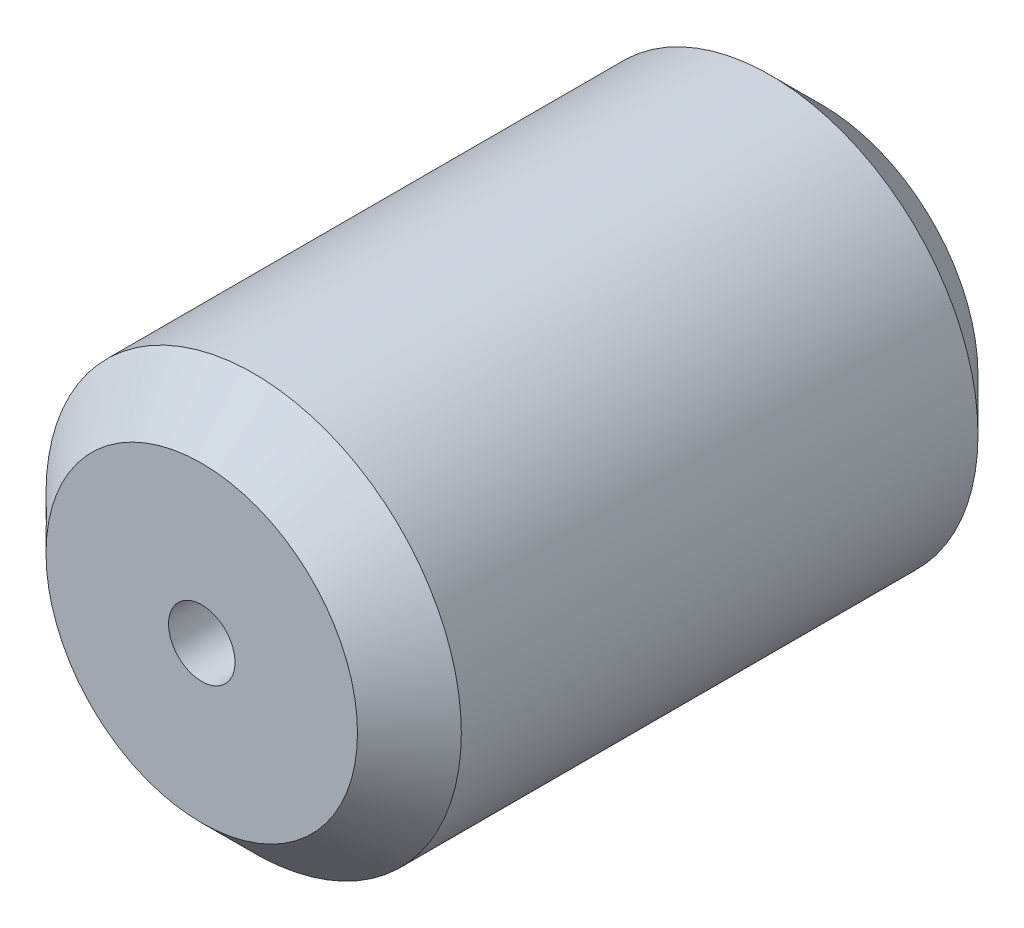
ISO-10303-21;
HEADER;
FILE_DESCRIPTION(('STEP AP214'),'2;1');
FILE_NAME('part.step','',(''),(''),'','','');
FILE_SCHEMA(('AUTOMOTIVE_DESIGN { 1 0 10303 214 1 1 1 1 }'));
ENDSEC;
DATA;
#1=APPLICATION_CONTEXT('core data for automotive mechanical design processes');
#2=APPLICATION_PROTOCOL_DEFINITION('international standard','automotive_design',2000,#1);
#3=PRODUCT_CONTEXT('',#1,'mechanical');
#4=PRODUCT('Part','Part','',(#3));
#5=PRODUCT_RELATED_PRODUCT_CATEGORY('part','',(#4));
#6=PRODUCT_DEFINITION_FORMATION('','',#4);
#7=PRODUCT_DEFINITION_CONTEXT('part definition',#1,'design');
#8=PRODUCT_DEFINITION('design','',#6,#7);
#9=PRODUCT_DEFINITION_SHAPE('','',#8);
#10=(LENGTH_UNIT() NAMED_UNIT(*) SI_UNIT(.MILLI.,.METRE.));
#11=(NAMED_UNIT(*) PLANE_ANGLE_UNIT() SI_UNIT($,.RADIAN.));
#12=(NAMED_UNIT(*) SI_UNIT($,.STERADIAN.) SOLID_ANGLE_UNIT());
#13=UNCERTAINTY_MEASURE_WITH_UNIT(LENGTH_MEASURE(1.E-05),#10,'distance_accuracy_value','');
#14=(GEOMETRIC_REPRESENTATION_CONTEXT(3) GLOBAL_UNCERTAINTY_ASSIGNED_CONTEXT((#13)) GLOBAL_UNIT_ASSIGNED_CONTEXT((#10,
#11,#12)) REPRESENTATION_CONTEXT('',''));
#15=CARTESIAN_POINT('',(0.,0.,0.));
#16=DIRECTION('',(0.,0.,1.));
#17=DIRECTION('',(1.,0.,0.));
#18=AXIS2_PLACEMENT_3D('',#15,#16,#17);
#19=CARTESIAN_POINT('',(0.,0.,-9.4869));
#20=DIRECTION('',(0.,0.,1.));
#21=DIRECTION('',(1.,0.,0.));
#22=AXIS2_PLACEMENT_3D('',#19,#20,#21);
#23=CYLINDRICAL_SURFACE('',#22,6.35);
#24=CARTESIAN_POINT('',(0.,0.,-7.89939999999999));
#25=DIRECTION('',(0.,0.,1.));
#26=DIRECTION('',(1.,0.,0.));
#27=AXIS2_PLACEMENT_3D('',#24,#25,#26);
#28=CIRCLE('',#27,6.35);
#29=CARTESIAN_POINT('',(6.35,0.,-7.89939999999999));
#30=VERTEX_POINT('',#29);
#31=EDGE_CURVE('E57',#30,#30,#28,.T.);
#32=CARTESIAN_POINT('',(0.,0.,7.8994));
#33=DIRECTION('',(0.,0.,1.));
#34=DIRECTION('',(1.,0.,0.));
#35=AXIS2_PLACEMENT_3D('',#32,#33,#34);
#36=CIRCLE('',#35,6.35);
#37=CARTESIAN_POINT('',(6.35,0.,7.8994));
#38=VERTEX_POINT('',#37);
#39=EDGE_CURVE('E62',#38,#38,#36,.F.);
#40=CARTESIAN_POINT('',(6.35,0.,-7.89939999999999));
#41=CARTESIAN_POINT('',(6.35,0.,-7.73482916666666));
#42=CARTESIAN_POINT('',(6.35,0.,-7.57025833333333));
#43=CARTESIAN_POINT('',(6.35,0.,-7.24111666666666));
#44=CARTESIAN_POINT('',(6.35,0.,-7.07654583333333));
#45=CARTESIAN_POINT('',(6.35,0.,-6.74740416666666));
#46=CARTESIAN_POINT('',(6.35,0.,-6.58283333333333));
#47=CARTESIAN_POINT('',(6.35,0.,-6.25369166666666));
#48=CARTESIAN_POINT('',(6.35,0.,-6.08912083333333));
#49=CARTESIAN_POINT('',(6.35,0.,-5.75997916666666));
#50=CARTESIAN_POINT('',(6.35,0.,-5.59540833333333));
#51=CARTESIAN_POINT('',(6.35,0.,-5.26626666666666));
#52=CARTESIAN_POINT('',(6.35,0.,-5.10169583333333));
#53=CARTESIAN_POINT('',(6.35,0.,-4.77255416666666));
#54=CARTESIAN_POINT('',(6.35,0.,-4.60798333333333));
#55=CARTESIAN_POINT('',(6.35,0.,-4.27884166666666));
#56=CARTESIAN_POINT('',(6.35,0.,-4.11427083333333));
#57=CARTESIAN_POINT('',(6.35,0.,-3.78512916666666));
#58=CARTESIAN_POINT('',(6.35,0.,-3.62055833333333));
#59=CARTESIAN_POINT('',(6.35,0.,-3.29141666666666));
#60=CARTESIAN_POINT('',(6.35,0.,-3.12684583333333));
#61=CARTESIAN_POINT('',(6.35,0.,-2.79770416666666));
#62=CARTESIAN_POINT('',(6.35,0.,-2.63313333333333));
#63=CARTESIAN_POINT('',(6.35,0.,-2.30399166666666));
#64=CARTESIAN_POINT('',(6.35,0.,-2.13942083333333));
#65=CARTESIAN_POINT('',(6.35,0.,-1.81027916666666));
#66=CARTESIAN_POINT('',(6.35,0.,-1.64570833333333));
#67=CARTESIAN_POINT('',(6.35,0.,-1.31656666666666));
#68=CARTESIAN_POINT('',(6.35,0.,-1.15199583333333));
#69=CARTESIAN_POINT('',(6.35,0.,-0.822854166666664));
#70=CARTESIAN_POINT('',(6.35,0.,-0.658283333333331));
#71=CARTESIAN_POINT('',(6.35,0.,-0.329141666666665));
#72=CARTESIAN_POINT('',(6.35,0.,-0.164570833333332));
#73=CARTESIAN_POINT('',(6.35,0.,0.164570833333335));
#74=CARTESIAN_POINT('',(6.35,0.,0.329141666666668));
#75=CARTESIAN_POINT('',(6.35,0.,0.658283333333335));
#76=CARTESIAN_POINT('',(6.35,0.,0.822854166666668));
#77=CARTESIAN_POINT('',(6.35,0.,1.15199583333334));
#78=CARTESIAN_POINT('',(6.35,0.,1.31656666666667));
#79=CARTESIAN_POINT('',(6.35,0.,1.64570833333334));
#80=CARTESIAN_POINT('',(6.35,0.,1.81027916666667));
#81=CARTESIAN_POINT('',(6.35,0.,2.13942083333334));
#82=CARTESIAN_POINT('',(6.35,0.,2.30399166666667));
#83=CARTESIAN_POINT('',(6.35,0.,2.63313333333334));
#84=CARTESIAN_POINT('',(6.35,0.,2.79770416666667));
#85=CARTESIAN_POINT('',(6.35,0.,3.12684583333334));
#86=CARTESIAN_POINT('',(6.35,0.,3.29141666666667));
#87=CARTESIAN_POINT('',(6.35,0.,3.62055833333334));
#88=CARTESIAN_POINT('',(6.35,0.,3.78512916666667));
#89=CARTESIAN_POINT('',(6.35,0.,4.11427083333333));
#90=CARTESIAN_POINT('',(6.35,0.,4.27884166666667));
#91=CARTESIAN_POINT('',(6.35,0.,4.60798333333333));
#92=CARTESIAN_POINT('',(6.35,0.,4.77255416666667));
#93=CARTESIAN_POINT('',(6.35,0.,5.10169583333333));
#94=CARTESIAN_POINT('',(6.35,0.,5.26626666666667));
#95=CARTESIAN_POINT('',(6.35,0.,5.59540833333333));
#96=CARTESIAN_POINT('',(6.35,0.,5.75997916666667));
#97=CARTESIAN_POINT('',(6.35,0.,6.08912083333333));
#98=CARTESIAN_POINT('',(6.35,0.,6.25369166666666));
#99=CARTESIAN_POINT('',(6.35,0.,6.58283333333333));
#100=CARTESIAN_POINT('',(6.35,0.,6.74740416666666));
#101=CARTESIAN_POINT('',(6.35,0.,7.07654583333333));
#102=CARTESIAN_POINT('',(6.35,0.,7.24111666666666));
#103=CARTESIAN_POINT('',(6.35,0.,7.57025833333333));
#104=CARTESIAN_POINT('',(6.35,0.,7.73482916666666));
#105=CARTESIAN_POINT('',(6.35,0.,7.8994));
#106=B_SPLINE_CURVE_WITH_KNOTS('',3,(#40,#41,#42,#43,#44,#45,#46,#47,#48,#49,#50,#51,#52,#53,
#54,#55,#56,#57,#58,#59,#60,#61,#62,#63,#64,#65,#66,#67,#68,#69,#70,#71,#72,#73,#74,#75,#76,#77,
#78,#79,#80,#81,#82,#83,#84,#85,#86,#87,#88,#89,#90,#91,#92,#93,#94,#95,#96,#97,#98,#99,#100,
#101,#102,#103,#104,#105),.UNSPECIFIED.,.F.,.F.,(4,2,2,2,2,2,2,2,2,2,2,2,2,2,2,2,2,2,2,2,2,2,2,
2,2,2,2,2,2,2,2,2,4),(0.,0.4937125,0.987425,1.4811375,1.97485,2.4685625,2.962275,3.4559875,
3.9497,4.4434125,4.937125,5.4308375,5.92455,6.4182625,6.911975,7.40568749999999,
7.89939999999999,8.39311249999999,8.88682499999999,9.38053749999999,9.87424999999999,10.3679625,
10.861675,11.3553875,11.8491,12.3428125,12.836525,13.3302375,13.82395,14.3176625,14.811375,
15.3050875,15.7988),.UNSPECIFIED.);
#107=EDGE_CURVE('BSEAM43',#30,#38,#106,.T.);
#108=ORIENTED_EDGE('',*,*,#31,.T.);
#109=ORIENTED_EDGE('',*,*,#39,.T.);
#110=ORIENTED_EDGE('',*,*,#107,.T.);
#111=ORIENTED_EDGE('',*,*,#107,.F.);
#112=EDGE_LOOP('',(#108,#110,#109,#111));
#113=FACE_BOUND('',#112,.T.);
#114=ADVANCED_FACE('F43',(#113),#23,.T.);
#115=CARTESIAN_POINT('',(0.,0.,-9.4869));
#116=DIRECTION('',(0.,0.,1.));
#117=DIRECTION('',(1.,0.,0.));
#118=AXIS2_PLACEMENT_3D('',#115,#116,#117);
#119=PLANE('',#118);
#120=CARTESIAN_POINT('',(0.,0.,-9.4869));
#121=DIRECTION('',(0.,0.,1.));
#122=DIRECTION('',(1.,0.,0.));
#123=AXIS2_PLACEMENT_3D('',#120,#121,#122);
#124=CIRCLE('',#123,4.76249999999999);
#125=CARTESIAN_POINT('',(4.76249999999999,0.,-9.4869));
#126=VERTEX_POINT('',#125);
#127=EDGE_CURVE('E52',#126,#126,#124,.F.);
#128=ORIENTED_EDGE('',*,*,#127,.T.);
#129=EDGE_LOOP('',(#128));
#130=FACE_BOUND('',#129,.T.);
#131=CARTESIAN_POINT('',(0.,0.,-9.4869));
#132=DIRECTION('',(0.,0.,1.));
#133=DIRECTION('',(1.,0.,0.));
#134=AXIS2_PLACEMENT_3D('',#131,#132,#133);
#135=CIRCLE('',#134,1.016);
#136=CARTESIAN_POINT('',(1.016,0.,-9.4869));
#137=VERTEX_POINT('',#136);
#138=EDGE_CURVE('E68',#137,#137,#135,.T.);
#139=ORIENTED_EDGE('',*,*,#138,.T.);
#140=EDGE_LOOP('',(#139));
#141=FACE_BOUND('',#140,.T.);
#142=ADVANCED_FACE('F89',(#130,#141),#119,.F.);
#143=CARTESIAN_POINT('',(0.,0.,-9.4869));
#144=DIRECTION('',(0.,0.,1.));
#145=DIRECTION('',(1.,0.,0.));
#146=AXIS2_PLACEMENT_3D('',#143,#144,#145);
#147=CYLINDRICAL_SURFACE('',#146,1.016);
#148=CARTESIAN_POINT('',(0.,0.,9.4869));
#149=DIRECTION('',(0.,0.,1.));
#150=DIRECTION('',(1.,0.,0.));
#151=AXIS2_PLACEMENT_3D('',#148,#149,#150);
#152=CIRCLE('',#151,1.016);
#153=CARTESIAN_POINT('',(1.016,0.,9.4869));
#154=VERTEX_POINT('',#153);
#155=EDGE_CURVE('E72',#154,#154,#152,.T.);
#156=CARTESIAN_POINT('',(1.016,0.,-9.4869));
#157=CARTESIAN_POINT('',(1.016,0.,-9.28925625));
#158=CARTESIAN_POINT('',(1.016,0.,-9.0916125));
#159=CARTESIAN_POINT('',(1.016,0.,-8.696325));
#160=CARTESIAN_POINT('',(1.016,0.,-8.49868125));
#161=CARTESIAN_POINT('',(1.016,0.,-8.10339375));
#162=CARTESIAN_POINT('',(1.016,0.,-7.90575));
#163=CARTESIAN_POINT('',(1.016,0.,-7.5104625));
#164=CARTESIAN_POINT('',(1.016,0.,-7.31281875));
#165=CARTESIAN_POINT('',(1.016,0.,-6.91753125));
#166=CARTESIAN_POINT('',(1.016,0.,-6.7198875));
#167=CARTESIAN_POINT('',(1.016,0.,-6.3246));
#168=CARTESIAN_POINT('',(1.016,0.,-6.12695625));
#169=CARTESIAN_POINT('',(1.016,0.,-5.73166875));
#170=CARTESIAN_POINT('',(1.016,0.,-5.534025));
#171=CARTESIAN_POINT('',(1.016,0.,-5.1387375));
#172=CARTESIAN_POINT('',(1.016,0.,-4.94109375));
#173=CARTESIAN_POINT('',(1.016,0.,-4.54580625));
#174=CARTESIAN_POINT('',(1.016,0.,-4.3481625));
#175=CARTESIAN_POINT('',(1.016,0.,-3.952875));
#176=CARTESIAN_POINT('',(1.016,0.,-3.75523125));
#177=CARTESIAN_POINT('',(1.016,0.,-3.35994375));
#178=CARTESIAN_POINT('',(1.016,0.,-3.1623));
#179=CARTESIAN_POINT('',(1.016,0.,-2.7670125));
#180=CARTESIAN_POINT('',(1.016,0.,-2.56936875));
#181=CARTESIAN_POINT('',(1.016,0.,-2.17408125));
#182=CARTESIAN_POINT('',(1.016,0.,-1.9764375));
#183=CARTESIAN_POINT('',(1.016,0.,-1.58115));
#184=CARTESIAN_POINT('',(1.016,0.,-1.38350625));
#185=CARTESIAN_POINT('',(1.016,0.,-0.988218750000001));
#186=CARTESIAN_POINT('',(1.016,0.,-0.790575000000001));
#187=CARTESIAN_POINT('',(1.016,0.,-0.395287500000001));
#188=CARTESIAN_POINT('',(1.016,0.,-0.197643750000002));
#189=CARTESIAN_POINT('',(1.016,0.,0.197643749999998));
#190=CARTESIAN_POINT('',(1.016,0.,0.395287499999998));
#191=CARTESIAN_POINT('',(1.016,0.,0.790574999999998));
#192=CARTESIAN_POINT('',(1.016,0.,0.988218749999998));
#193=CARTESIAN_POINT('',(1.016,0.,1.38350625));
#194=CARTESIAN_POINT('',(1.016,0.,1.58115));
#195=CARTESIAN_POINT('',(1.016,0.,1.9764375));
#196=CARTESIAN_POINT('',(1.016,0.,2.17408125));
#197=CARTESIAN_POINT('',(1.016,0.,2.56936875));
#198=CARTESIAN_POINT('',(1.016,0.,2.7670125));
#199=CARTESIAN_POINT('',(1.016,0.,3.1623));
#200=CARTESIAN_POINT('',(1.016,0.,3.35994375));
#201=CARTESIAN_POINT('',(1.016,0.,3.75523125));
#202=CARTESIAN_POINT('',(1.016,0.,3.952875));
#203=CARTESIAN_POINT('',(1.016,0.,4.3481625));
#204=CARTESIAN_POINT('',(1.016,0.,4.54580625));
#205=CARTESIAN_POINT('',(1.016,0.,4.94109375));
#206=CARTESIAN_POINT('',(1.016,0.,5.1387375));
#207=CARTESIAN_POINT('',(1.016,0.,5.534025));
#208=CARTESIAN_POINT('',(1.016,0.,5.73166875));
#209=CARTESIAN_POINT('',(1.016,0.,6.12695625));
#210=CARTESIAN_POINT('',(1.016,0.,6.3246));
#211=CARTESIAN_POINT('',(1.016,0.,6.7198875));
#212=CARTESIAN_POINT('',(1.016,0.,6.91753125));
#213=CARTESIAN_POINT('',(1.016,0.,7.31281875));
#214=CARTESIAN_POINT('',(1.016,0.,7.5104625));
#215=CARTESIAN_POINT('',(1.016,0.,7.90575));
#216=CARTESIAN_POINT('',(1.016,0.,8.10339375));
#217=CARTESIAN_POINT('',(1.016,0.,8.49868125));
#218=CARTESIAN_POINT('',(1.016,0.,8.696325));
#219=CARTESIAN_POINT('',(1.016,0.,9.09161249999999));
#220=CARTESIAN_POINT('',(1.016,0.,9.28925625));
#221=CARTESIAN_POINT('',(1.016,0.,9.4869));
#222=B_SPLINE_CURVE_WITH_KNOTS('',3,(#156,#157,#158,#159,#160,#161,#162,#163,#164,#165,#166,
#167,#168,#169,#170,#171,#172,#173,#174,#175,#176,#177,#178,#179,#180,#181,#182,#183,#184,#185,
#186,#187,#188,#189,#190,#191,#192,#193,#194,#195,#196,#197,#198,#199,#200,#201,#202,#203,#204,
#205,#206,#207,#208,#209,#210,#211,#212,#213,#214,#215,#216,#217,#218,#219,#220,#221),
.UNSPECIFIED.,.F.,.F.,(4,2,2,2,2,2,2,2,2,2,2,2,2,2,2,2,2,2,2,2,2,2,2,2,2,2,2,2,2,2,2,2,4),(0.,
0.59293125,1.1858625,1.77879375,2.371725,2.96465625,3.5575875,4.15051875,4.74345,5.33638125,
5.9293125,6.52224375,7.115175,7.70810625,8.3010375,8.89396875,9.4869,10.07983125,10.6727625,
11.26569375,11.858625,12.45155625,13.0444875,13.63741875,14.23035,14.82328125,15.4162125,
16.00914375,16.602075,17.19500625,17.7879375,18.38086875,18.9738),.UNSPECIFIED.);
#223=EDGE_CURVE('BSEAM77',#137,#154,#222,.T.);
#224=ORIENTED_EDGE('',*,*,#138,.F.);
#225=ORIENTED_EDGE('',*,*,#155,.T.);
#226=ORIENTED_EDGE('',*,*,#223,.T.);
#227=ORIENTED_EDGE('',*,*,#223,.F.);
#228=EDGE_LOOP('',(#224,#226,#225,#227));
#229=FACE_BOUND('',#228,.T.);
#230=ADVANCED_FACE('F77',(#229),#147,.F.);
#231=CARTESIAN_POINT('',(0.,0.,9.4869));
#232=DIRECTION('',(0.,0.,1.));
#233=DIRECTION('',(1.,0.,0.));
#234=AXIS2_PLACEMENT_3D('',#231,#232,#233);
#235=PLANE('',#234);
#236=CARTESIAN_POINT('',(0.,0.,9.4869));
#237=DIRECTION('',(0.,0.,1.));
#238=DIRECTION('',(1.,0.,0.));
#239=AXIS2_PLACEMENT_3D('',#236,#237,#238);
#240=CIRCLE('',#239,4.7625);
#241=CARTESIAN_POINT('',(4.7625,0.,9.4869));
#242=VERTEX_POINT('',#241);
#243=EDGE_CURVE('E10',#242,#242,#240,.T.);
#244=ORIENTED_EDGE('',*,*,#243,.T.);
#245=EDGE_LOOP('',(#244));
#246=FACE_BOUND('',#245,.T.);
#247=ORIENTED_EDGE('',*,*,#155,.F.);
#248=EDGE_LOOP('',(#247));
#249=FACE_BOUND('',#248,.T.);
#250=ADVANCED_FACE('F79',(#246,#249),#235,.T.);
#251=CARTESIAN_POINT('',(0.,0.,-7.89939999999999));
#252=DIRECTION('',(0.,0.,1.));
#253=DIRECTION('',(1.,0.,0.));
#254=AXIS2_PLACEMENT_3D('',#251,#252,#253);
#255=CONICAL_SURFACE('',#254,6.35,0.785398163397449);
#256=ORIENTED_EDGE('',*,*,#127,.F.);
#257=EDGE_LOOP('',(#256));
#258=FACE_BOUND('',#257,.T.);
#259=ORIENTED_EDGE('',*,*,#31,.F.);
#260=EDGE_LOOP('',(#259));
#261=FACE_BOUND('',#260,.T.);
#262=ADVANCED_FACE('F81',(#258,#261),#255,.T.);
#263=CARTESIAN_POINT('',(0.,0.,9.4869));
#264=DIRECTION('',(0.,0.,-1.));
#265=DIRECTION('',(-1.,0.,0.));
#266=AXIS2_PLACEMENT_3D('',#263,#264,#265);
#267=CONICAL_SURFACE('',#266,4.7625,0.785398163397448);
#268=ORIENTED_EDGE('',*,*,#39,.F.);
#269=EDGE_LOOP('',(#268));
#270=FACE_BOUND('',#269,.T.);
#271=ORIENTED_EDGE('',*,*,#243,.F.);
#272=EDGE_LOOP('',(#271));
#273=FACE_BOUND('',#272,.T.);
#274=ADVANCED_FACE('F46',(#270,#273),#267,.T.);
#275=CLOSED_SHELL('',(#114,#142,#230,#250,#262,#274));
#276=MANIFOLD_SOLID_BREP('B2',#275);
#277=ADVANCED_BREP_SHAPE_REPRESENTATION('',(#18,#276),#14);
#278=SHAPE_DEFINITION_REPRESENTATION(#9,#277);
ENDSEC;
END-ISO-10303-21;
